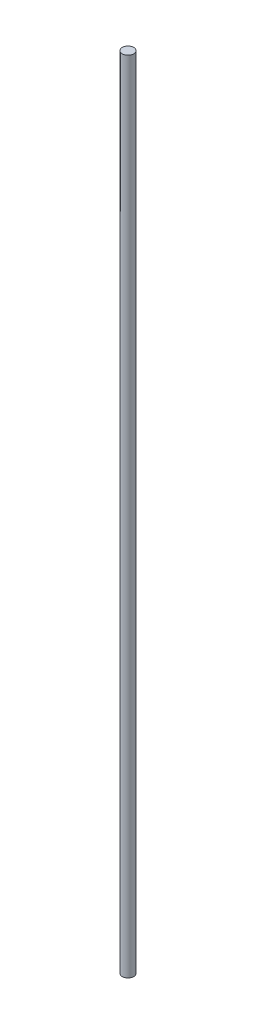
ISO-10303-21;
HEADER;
FILE_DESCRIPTION(('STEP AP214'),'2;1');
FILE_NAME('part.step','',(''),(''),'','','');
FILE_SCHEMA(('AUTOMOTIVE_DESIGN { 1 0 10303 214 1 1 1 1 }'));
ENDSEC;
DATA;
#1=APPLICATION_CONTEXT('core data for automotive mechanical design processes');
#2=APPLICATION_PROTOCOL_DEFINITION('international standard','automotive_design',2000,#1);
#3=PRODUCT_CONTEXT('',#1,'mechanical');
#4=PRODUCT('Part','Part','',(#3));
#5=PRODUCT_RELATED_PRODUCT_CATEGORY('part','',(#4));
#6=PRODUCT_DEFINITION_FORMATION('','',#4);
#7=PRODUCT_DEFINITION_CONTEXT('part definition',#1,'design');
#8=PRODUCT_DEFINITION('design','',#6,#7);
#9=PRODUCT_DEFINITION_SHAPE('','',#8);
#10=(LENGTH_UNIT() NAMED_UNIT(*) SI_UNIT(.MILLI.,.METRE.));
#11=(NAMED_UNIT(*) PLANE_ANGLE_UNIT() SI_UNIT($,.RADIAN.));
#12=(NAMED_UNIT(*) SI_UNIT($,.STERADIAN.) SOLID_ANGLE_UNIT());
#13=UNCERTAINTY_MEASURE_WITH_UNIT(LENGTH_MEASURE(1.E-05),#10,'distance_accuracy_value','');
#14=(GEOMETRIC_REPRESENTATION_CONTEXT(3) GLOBAL_UNCERTAINTY_ASSIGNED_CONTEXT((#13)) GLOBAL_UNIT_ASSIGNED_CONTEXT((#10,
#11,#12)) REPRESENTATION_CONTEXT('',''));
#15=CARTESIAN_POINT('',(0.,0.,0.));
#16=DIRECTION('',(0.,0.,1.));
#17=DIRECTION('',(1.,0.,0.));
#18=AXIS2_PLACEMENT_3D('',#15,#16,#17);
#19=CARTESIAN_POINT('',(0.,224.08388,0.));
#20=DIRECTION('',(0.,-1.,0.));
#21=DIRECTION('',(0.,0.,-1.));
#22=AXIS2_PLACEMENT_3D('',#19,#20,#21);
#23=CYLINDRICAL_SURFACE('',#22,1.5875);
#24=CARTESIAN_POINT('',(0.,224.08388,0.));
#25=DIRECTION('',(0.,1.,0.));
#26=DIRECTION('',(0.,0.,1.));
#27=AXIS2_PLACEMENT_3D('',#24,#25,#26);
#28=CIRCLE('',#27,1.5875);
#29=CARTESIAN_POINT('',(0.,224.08388,1.5875));
#30=VERTEX_POINT('',#29);
#31=EDGE_CURVE('E10',#30,#30,#28,.T.);
#32=ORIENTED_EDGE('',*,*,#31,.F.);
#33=EDGE_LOOP('',(#32));
#34=FACE_BOUND('',#33,.T.);
#35=CARTESIAN_POINT('',(0.,0.,0.));
#36=DIRECTION('',(0.,1.,0.));
#37=DIRECTION('',(0.,0.,1.));
#38=AXIS2_PLACEMENT_3D('',#35,#36,#37);
#39=CIRCLE('',#38,1.5875);
#40=CARTESIAN_POINT('',(0.,0.,1.5875));
#41=VERTEX_POINT('',#40);
#42=EDGE_CURVE('E34',#41,#41,#39,.T.);
#43=ORIENTED_EDGE('',*,*,#42,.T.);
#44=EDGE_LOOP('',(#43));
#45=FACE_BOUND('',#44,.T.);
#46=ADVANCED_FACE('F31',(#34,#45),#23,.T.);
#47=CARTESIAN_POINT('',(0.,224.08388,0.));
#48=DIRECTION('',(0.,1.,0.));
#49=DIRECTION('',(0.,0.,1.));
#50=AXIS2_PLACEMENT_3D('',#47,#48,#49);
#51=PLANE('',#50);
#52=ORIENTED_EDGE('',*,*,#31,.T.);
#53=EDGE_LOOP('',(#52));
#54=FACE_BOUND('',#53,.T.);
#55=ADVANCED_FACE('F46',(#54),#51,.T.);
#56=CARTESIAN_POINT('',(0.,0.,0.));
#57=DIRECTION('',(0.,1.,0.));
#58=DIRECTION('',(0.,0.,1.));
#59=AXIS2_PLACEMENT_3D('',#56,#57,#58);
#60=PLANE('',#59);
#61=ORIENTED_EDGE('',*,*,#42,.F.);
#62=EDGE_LOOP('',(#61));
#63=FACE_BOUND('',#62,.T.);
#64=ADVANCED_FACE('F44',(#63),#60,.F.);
#65=CLOSED_SHELL('',(#46,#55,#64));
#66=MANIFOLD_SOLID_BREP('B2',#65);
#67=ADVANCED_BREP_SHAPE_REPRESENTATION('',(#18,#66),#14);
#68=SHAPE_DEFINITION_REPRESENTATION(#9,#67);
ENDSEC;
END-ISO-10303-21;
